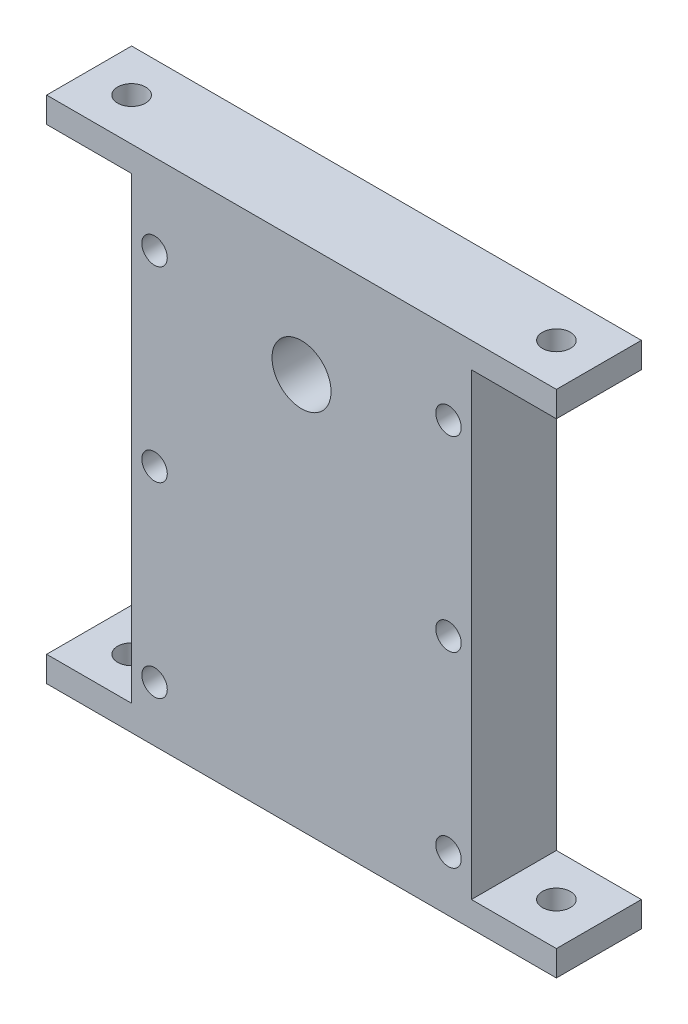
ISO-10303-21;
HEADER;
FILE_DESCRIPTION(('STEP AP214'),'2;1');
FILE_NAME('part.step','',(''),(''),'','','');
FILE_SCHEMA(('AUTOMOTIVE_DESIGN { 1 0 10303 214 1 1 1 1 }'));
ENDSEC;
DATA;
#1=APPLICATION_CONTEXT('core data for automotive mechanical design processes');
#2=APPLICATION_PROTOCOL_DEFINITION('international standard','automotive_design',2000,#1);
#3=PRODUCT_CONTEXT('',#1,'mechanical');
#4=PRODUCT('Part','Part','',(#3));
#5=PRODUCT_RELATED_PRODUCT_CATEGORY('part','',(#4));
#6=PRODUCT_DEFINITION_FORMATION('','',#4);
#7=PRODUCT_DEFINITION_CONTEXT('part definition',#1,'design');
#8=PRODUCT_DEFINITION('design','',#6,#7);
#9=PRODUCT_DEFINITION_SHAPE('','',#8);
#10=(LENGTH_UNIT() NAMED_UNIT(*) SI_UNIT(.MILLI.,.METRE.));
#11=(NAMED_UNIT(*) PLANE_ANGLE_UNIT() SI_UNIT($,.RADIAN.));
#12=(NAMED_UNIT(*) SI_UNIT($,.STERADIAN.) SOLID_ANGLE_UNIT());
#13=UNCERTAINTY_MEASURE_WITH_UNIT(LENGTH_MEASURE(1.E-05),#10,'distance_accuracy_value','');
#14=(GEOMETRIC_REPRESENTATION_CONTEXT(3) GLOBAL_UNCERTAINTY_ASSIGNED_CONTEXT((#13)) GLOBAL_UNIT_ASSIGNED_CONTEXT((#10,
#11,#12)) REPRESENTATION_CONTEXT('',''));
#15=CARTESIAN_POINT('',(0.,0.,0.));
#16=DIRECTION('',(0.,0.,1.));
#17=DIRECTION('',(1.,0.,0.));
#18=AXIS2_PLACEMENT_3D('',#15,#16,#17);
#19=CARTESIAN_POINT('',(-20.,30.,10.));
#20=DIRECTION('',(1.,0.,0.));
#21=DIRECTION('',(0.,1.,0.));
#22=AXIS2_PLACEMENT_3D('',#19,#20,#21);
#23=PLANE('',#22);
#24=DIRECTION('',(0.,0.,-1.));
#25=VECTOR('',#24,1.);
#26=CARTESIAN_POINT('',(-20.,-27.,0.));
#27=LINE('',#26,#25);
#28=CARTESIAN_POINT('',(-20.,-27.,10.));
#29=VERTEX_POINT('',#28);
#30=CARTESIAN_POINT('',(-20.,-27.,0.));
#31=VERTEX_POINT('',#30);
#32=EDGE_CURVE('E137',#29,#31,#27,.T.);
#33=ORIENTED_EDGE('',*,*,#32,.F.);
#34=DIRECTION('',(0.,-1.,0.));
#35=VECTOR('',#34,1.);
#36=CARTESIAN_POINT('',(-20.,30.,10.));
#37=LINE('',#36,#35);
#38=CARTESIAN_POINT('',(-20.,27.,10.));
#39=VERTEX_POINT('',#38);
#40=EDGE_CURVE('E55',#39,#29,#37,.T.);
#41=ORIENTED_EDGE('',*,*,#40,.F.);
#42=DIRECTION('',(0.,0.,1.));
#43=VECTOR('',#42,1.);
#44=CARTESIAN_POINT('',(-20.,27.,10.));
#45=LINE('',#44,#43);
#46=CARTESIAN_POINT('',(-20.,27.,0.));
#47=VERTEX_POINT('',#46);
#48=EDGE_CURVE('E63',#47,#39,#45,.T.);
#49=ORIENTED_EDGE('',*,*,#48,.F.);
#50=DIRECTION('',(0.,-1.,0.));
#51=VECTOR('',#50,1.);
#52=CARTESIAN_POINT('',(-20.,30.,0.));
#53=LINE('',#52,#51);
#54=EDGE_CURVE('E154',#47,#31,#53,.T.);
#55=ORIENTED_EDGE('',*,*,#54,.T.);
#56=EDGE_LOOP('',(#33,#41,#49,#55));
#57=FACE_BOUND('',#56,.T.);
#58=ADVANCED_FACE('F45',(#57),#23,.F.);
#59=CARTESIAN_POINT('',(20.,30.,10.));
#60=DIRECTION('',(-1.,0.,0.));
#61=DIRECTION('',(0.,-1.,0.));
#62=AXIS2_PLACEMENT_3D('',#59,#60,#61);
#63=PLANE('',#62);
#64=DIRECTION('',(0.,0.,1.));
#65=VECTOR('',#64,1.);
#66=CARTESIAN_POINT('',(20.,-27.,0.));
#67=LINE('',#66,#65);
#68=CARTESIAN_POINT('',(20.,-27.,0.));
#69=VERTEX_POINT('',#68);
#70=CARTESIAN_POINT('',(20.,-27.,10.));
#71=VERTEX_POINT('',#70);
#72=EDGE_CURVE('E248',#69,#71,#67,.T.);
#73=ORIENTED_EDGE('',*,*,#72,.F.);
#74=DIRECTION('',(0.,1.,0.));
#75=VECTOR('',#74,1.);
#76=CARTESIAN_POINT('',(20.,30.,0.));
#77=LINE('',#76,#75);
#78=CARTESIAN_POINT('',(20.,27.,0.));
#79=VERTEX_POINT('',#78);
#80=EDGE_CURVE('E167',#69,#79,#77,.T.);
#81=ORIENTED_EDGE('',*,*,#80,.T.);
#82=DIRECTION('',(0.,0.,-1.));
#83=VECTOR('',#82,1.);
#84=CARTESIAN_POINT('',(20.,27.,10.));
#85=LINE('',#84,#83);
#86=CARTESIAN_POINT('',(20.,27.,10.));
#87=VERTEX_POINT('',#86);
#88=EDGE_CURVE('E251',#87,#79,#85,.T.);
#89=ORIENTED_EDGE('',*,*,#88,.F.);
#90=DIRECTION('',(0.,1.,0.));
#91=VECTOR('',#90,1.);
#92=CARTESIAN_POINT('',(20.,30.,10.));
#93=LINE('',#92,#91);
#94=EDGE_CURVE('E71',#71,#87,#93,.T.);
#95=ORIENTED_EDGE('',*,*,#94,.F.);
#96=EDGE_LOOP('',(#73,#81,#89,#95));
#97=FACE_BOUND('',#96,.T.);
#98=ADVANCED_FACE('F47',(#97),#63,.F.);
#99=CARTESIAN_POINT('',(0.,0.,10.));
#100=DIRECTION('',(0.,0.,1.));
#101=DIRECTION('',(1.,0.,0.));
#102=AXIS2_PLACEMENT_3D('',#99,#100,#101);
#103=PLANE('',#102);
#104=CARTESIAN_POINT('',(17.3,-1.5,10.));
#105=DIRECTION('',(0.,0.,1.));
#106=DIRECTION('',(-1.,0.,0.));
#107=AXIS2_PLACEMENT_3D('',#104,#105,#106);
#108=CIRCLE('',#107,1.5);
#109=CARTESIAN_POINT('',(15.8,-1.5,10.));
#110=VERTEX_POINT('',#109);
#111=EDGE_CURVE('E299',#110,#110,#108,.T.);
#112=ORIENTED_EDGE('',*,*,#111,.F.);
#113=EDGE_LOOP('',(#112));
#114=FACE_BOUND('',#113,.T.);
#115=CARTESIAN_POINT('',(-17.3,-23.5,10.));
#116=DIRECTION('',(0.,0.,1.));
#117=DIRECTION('',(1.,0.,0.));
#118=AXIS2_PLACEMENT_3D('',#115,#116,#117);
#119=CIRCLE('',#118,1.5);
#120=CARTESIAN_POINT('',(-15.8,-23.5,10.));
#121=VERTEX_POINT('',#120);
#122=EDGE_CURVE('E315',#121,#121,#119,.T.);
#123=ORIENTED_EDGE('',*,*,#122,.F.);
#124=EDGE_LOOP('',(#123));
#125=FACE_BOUND('',#124,.T.);
#126=CARTESIAN_POINT('',(-17.3,20.5,10.));
#127=DIRECTION('',(0.,0.,1.));
#128=DIRECTION('',(1.,0.,0.));
#129=AXIS2_PLACEMENT_3D('',#126,#127,#128);
#130=CIRCLE('',#129,1.5);
#131=CARTESIAN_POINT('',(-15.8,20.5,10.));
#132=VERTEX_POINT('',#131);
#133=EDGE_CURVE('E331',#132,#132,#130,.T.);
#134=ORIENTED_EDGE('',*,*,#133,.F.);
#135=EDGE_LOOP('',(#134));
#136=FACE_BOUND('',#135,.T.);
#137=DIRECTION('',(1.,0.,0.));
#138=VECTOR('',#137,1.);
#139=CARTESIAN_POINT('',(-20.,-30.,10.));
#140=LINE('',#139,#138);
#141=CARTESIAN_POINT('',(-30.,-30.,10.));
#142=VERTEX_POINT('',#141);
#143=CARTESIAN_POINT('',(30.,-30.,10.));
#144=VERTEX_POINT('',#143);
#145=EDGE_CURVE('E11',#142,#144,#140,.T.);
#146=ORIENTED_EDGE('',*,*,#145,.T.);
#147=DIRECTION('',(0.,-1.,0.));
#148=VECTOR('',#147,1.);
#149=CARTESIAN_POINT('',(30.,-27.,10.));
#150=LINE('',#149,#148);
#151=CARTESIAN_POINT('',(30.,-27.,10.));
#152=VERTEX_POINT('',#151);
#153=EDGE_CURVE('E247',#152,#144,#150,.T.);
#154=ORIENTED_EDGE('',*,*,#153,.F.);
#155=DIRECTION('',(-1.,0.,0.));
#156=VECTOR('',#155,1.);
#157=CARTESIAN_POINT('',(30.,-27.,10.));
#158=LINE('',#157,#156);
#159=EDGE_CURVE('E243',#152,#71,#158,.T.);
#160=ORIENTED_EDGE('',*,*,#159,.T.);
#161=ORIENTED_EDGE('',*,*,#94,.T.);
#162=DIRECTION('',(-1.,0.,0.));
#163=VECTOR('',#162,1.);
#164=CARTESIAN_POINT('',(30.,27.,10.));
#165=LINE('',#164,#163);
#166=CARTESIAN_POINT('',(30.,27.,10.));
#167=VERTEX_POINT('',#166);
#168=EDGE_CURVE('E286',#167,#87,#165,.T.);
#169=ORIENTED_EDGE('',*,*,#168,.F.);
#170=DIRECTION('',(0.,-1.,0.));
#171=VECTOR('',#170,1.);
#172=CARTESIAN_POINT('',(30.,30.,10.));
#173=LINE('',#172,#171);
#174=CARTESIAN_POINT('',(30.,30.,10.));
#175=VERTEX_POINT('',#174);
#176=EDGE_CURVE('E273',#175,#167,#173,.T.);
#177=ORIENTED_EDGE('',*,*,#176,.F.);
#178=DIRECTION('',(-1.,0.,0.));
#179=VECTOR('',#178,1.);
#180=CARTESIAN_POINT('',(-20.,30.,10.));
#181=LINE('',#180,#179);
#182=CARTESIAN_POINT('',(-30.,30.,10.));
#183=VERTEX_POINT('',#182);
#184=EDGE_CURVE('E348',#175,#183,#181,.T.);
#185=ORIENTED_EDGE('',*,*,#184,.T.);
#186=DIRECTION('',(0.,1.,0.));
#187=VECTOR('',#186,1.);
#188=CARTESIAN_POINT('',(-30.,30.,10.));
#189=LINE('',#188,#187);
#190=CARTESIAN_POINT('',(-30.,27.,10.));
#191=VERTEX_POINT('',#190);
#192=EDGE_CURVE('E222',#191,#183,#189,.T.);
#193=ORIENTED_EDGE('',*,*,#192,.F.);
#194=DIRECTION('',(1.,0.,0.));
#195=VECTOR('',#194,1.);
#196=CARTESIAN_POINT('',(-30.,27.,10.));
#197=LINE('',#196,#195);
#198=EDGE_CURVE('E230',#191,#39,#197,.T.);
#199=ORIENTED_EDGE('',*,*,#198,.T.);
#200=ORIENTED_EDGE('',*,*,#40,.T.);
#201=DIRECTION('',(1.,0.,0.));
#202=VECTOR('',#201,1.);
#203=CARTESIAN_POINT('',(-30.,-27.,10.));
#204=LINE('',#203,#202);
#205=CARTESIAN_POINT('',(-30.,-27.,10.));
#206=VERTEX_POINT('',#205);
#207=EDGE_CURVE('E144',#206,#29,#204,.T.);
#208=ORIENTED_EDGE('',*,*,#207,.F.);
#209=DIRECTION('',(0.,1.,0.));
#210=VECTOR('',#209,1.);
#211=CARTESIAN_POINT('',(-30.,-30.,10.));
#212=LINE('',#211,#210);
#213=EDGE_CURVE('E206',#142,#206,#212,.T.);
#214=ORIENTED_EDGE('',*,*,#213,.F.);
#215=EDGE_LOOP('',(#146,#154,#160,#161,#169,#177,#185,#193,#199,#200,#208,#214));
#216=FACE_BOUND('',#215,.T.);
#217=CARTESIAN_POINT('',(-17.3,-1.5,10.));
#218=DIRECTION('',(0.,0.,1.));
#219=DIRECTION('',(1.,0.,0.));
#220=AXIS2_PLACEMENT_3D('',#217,#218,#219);
#221=CIRCLE('',#220,1.5);
#222=CARTESIAN_POINT('',(-15.8,-1.5,10.));
#223=VERTEX_POINT('',#222);
#224=EDGE_CURVE('E339',#223,#223,#221,.T.);
#225=ORIENTED_EDGE('',*,*,#224,.F.);
#226=EDGE_LOOP('',(#225));
#227=FACE_BOUND('',#226,.T.);
#228=CARTESIAN_POINT('',(0.,16.5,10.));
#229=DIRECTION('',(0.,0.,1.));
#230=DIRECTION('',(1.,0.,0.));
#231=AXIS2_PLACEMENT_3D('',#228,#229,#230);
#232=CIRCLE('',#231,3.475);
#233=CARTESIAN_POINT('',(3.475,16.5,10.));
#234=VERTEX_POINT('',#233);
#235=EDGE_CURVE('E323',#234,#234,#232,.T.);
#236=ORIENTED_EDGE('',*,*,#235,.F.);
#237=EDGE_LOOP('',(#236));
#238=FACE_BOUND('',#237,.T.);
#239=CARTESIAN_POINT('',(17.3,-23.5,10.));
#240=DIRECTION('',(0.,0.,1.));
#241=DIRECTION('',(-1.,0.,0.));
#242=AXIS2_PLACEMENT_3D('',#239,#240,#241);
#243=CIRCLE('',#242,1.5);
#244=CARTESIAN_POINT('',(15.8,-23.5,10.));
#245=VERTEX_POINT('',#244);
#246=EDGE_CURVE('E307',#245,#245,#243,.T.);
#247=ORIENTED_EDGE('',*,*,#246,.F.);
#248=EDGE_LOOP('',(#247));
#249=FACE_BOUND('',#248,.T.);
#250=CARTESIAN_POINT('',(17.3,20.5,10.));
#251=DIRECTION('',(0.,0.,1.));
#252=DIRECTION('',(-1.,0.,0.));
#253=AXIS2_PLACEMENT_3D('',#250,#251,#252);
#254=CIRCLE('',#253,1.5);
#255=CARTESIAN_POINT('',(15.8,20.5,10.));
#256=VERTEX_POINT('',#255);
#257=EDGE_CURVE('E291',#256,#256,#254,.T.);
#258=ORIENTED_EDGE('',*,*,#257,.F.);
#259=EDGE_LOOP('',(#258));
#260=FACE_BOUND('',#259,.T.);
#261=ADVANCED_FACE('F366',(#114,#125,#136,#216,#227,#238,#249,#260),#103,.T.);
#262=CARTESIAN_POINT('',(0.,0.,0.));
#263=DIRECTION('',(0.,0.,1.));
#264=DIRECTION('',(1.,0.,0.));
#265=AXIS2_PLACEMENT_3D('',#262,#263,#264);
#266=PLANE('',#265);
#267=ORIENTED_EDGE('',*,*,#80,.F.);
#268=DIRECTION('',(-1.,0.,0.));
#269=VECTOR('',#268,1.);
#270=CARTESIAN_POINT('',(30.,-27.,0.));
#271=LINE('',#270,#269);
#272=CARTESIAN_POINT('',(30.,-27.,0.));
#273=VERTEX_POINT('',#272);
#274=EDGE_CURVE('E239',#273,#69,#271,.T.);
#275=ORIENTED_EDGE('',*,*,#274,.F.);
#276=DIRECTION('',(0.,1.,0.));
#277=VECTOR('',#276,1.);
#278=CARTESIAN_POINT('',(30.,-30.,0.));
#279=LINE('',#278,#277);
#280=CARTESIAN_POINT('',(30.,-30.,0.));
#281=VERTEX_POINT('',#280);
#282=EDGE_CURVE('E259',#281,#273,#279,.T.);
#283=ORIENTED_EDGE('',*,*,#282,.F.);
#284=DIRECTION('',(1.,0.,0.));
#285=VECTOR('',#284,1.);
#286=CARTESIAN_POINT('',(-20.,-30.,0.));
#287=LINE('',#286,#285);
#288=CARTESIAN_POINT('',(-30.,-30.,0.));
#289=VERTEX_POINT('',#288);
#290=EDGE_CURVE('E161',#289,#281,#287,.T.);
#291=ORIENTED_EDGE('',*,*,#290,.F.);
#292=DIRECTION('',(0.,-1.,0.));
#293=VECTOR('',#292,1.);
#294=CARTESIAN_POINT('',(-30.,-30.,0.));
#295=LINE('',#294,#293);
#296=CARTESIAN_POINT('',(-30.,-27.,0.));
#297=VERTEX_POINT('',#296);
#298=EDGE_CURVE('E147',#297,#289,#295,.T.);
#299=ORIENTED_EDGE('',*,*,#298,.F.);
#300=DIRECTION('',(1.,0.,0.));
#301=VECTOR('',#300,1.);
#302=CARTESIAN_POINT('',(-30.,-27.,0.));
#303=LINE('',#302,#301);
#304=EDGE_CURVE('E141',#297,#31,#303,.T.);
#305=ORIENTED_EDGE('',*,*,#304,.T.);
#306=ORIENTED_EDGE('',*,*,#54,.F.);
#307=DIRECTION('',(1.,0.,0.));
#308=VECTOR('',#307,1.);
#309=CARTESIAN_POINT('',(-30.,27.,0.));
#310=LINE('',#309,#308);
#311=CARTESIAN_POINT('',(-30.,27.,0.));
#312=VERTEX_POINT('',#311);
#313=EDGE_CURVE('E236',#312,#47,#310,.T.);
#314=ORIENTED_EDGE('',*,*,#313,.F.);
#315=DIRECTION('',(0.,-1.,0.));
#316=VECTOR('',#315,1.);
#317=CARTESIAN_POINT('',(-30.,27.,0.));
#318=LINE('',#317,#316);
#319=CARTESIAN_POINT('',(-30.,30.,0.));
#320=VERTEX_POINT('',#319);
#321=EDGE_CURVE('E215',#320,#312,#318,.T.);
#322=ORIENTED_EDGE('',*,*,#321,.F.);
#323=DIRECTION('',(-1.,0.,0.));
#324=VECTOR('',#323,1.);
#325=CARTESIAN_POINT('',(-20.,30.,0.));
#326=LINE('',#325,#324);
#327=CARTESIAN_POINT('',(30.,30.,0.));
#328=VERTEX_POINT('',#327);
#329=EDGE_CURVE('E162',#328,#320,#326,.T.);
#330=ORIENTED_EDGE('',*,*,#329,.F.);
#331=DIRECTION('',(0.,1.,0.));
#332=VECTOR('',#331,1.);
#333=CARTESIAN_POINT('',(30.,27.,0.));
#334=LINE('',#333,#332);
#335=CARTESIAN_POINT('',(30.,27.,0.));
#336=VERTEX_POINT('',#335);
#337=EDGE_CURVE('E265',#336,#328,#334,.T.);
#338=ORIENTED_EDGE('',*,*,#337,.F.);
#339=DIRECTION('',(-1.,0.,0.));
#340=VECTOR('',#339,1.);
#341=CARTESIAN_POINT('',(30.,27.,0.));
#342=LINE('',#341,#340);
#343=EDGE_CURVE('E279',#336,#79,#342,.T.);
#344=ORIENTED_EDGE('',*,*,#343,.T.);
#345=EDGE_LOOP('',(#267,#275,#283,#291,#299,#305,#306,#314,#322,#330,#338,#344));
#346=FACE_BOUND('',#345,.T.);
#347=CARTESIAN_POINT('',(-17.3,-1.5,0.));
#348=DIRECTION('',(0.,0.,1.));
#349=DIRECTION('',(1.,0.,0.));
#350=AXIS2_PLACEMENT_3D('',#347,#348,#349);
#351=CIRCLE('',#350,1.5);
#352=CARTESIAN_POINT('',(-15.8,-1.5,0.));
#353=VERTEX_POINT('',#352);
#354=EDGE_CURVE('E335',#353,#353,#351,.T.);
#355=ORIENTED_EDGE('',*,*,#354,.T.);
#356=EDGE_LOOP('',(#355));
#357=FACE_BOUND('',#356,.T.);
#358=CARTESIAN_POINT('',(-17.3,20.5,0.));
#359=DIRECTION('',(0.,0.,1.));
#360=DIRECTION('',(1.,0.,0.));
#361=AXIS2_PLACEMENT_3D('',#358,#359,#360);
#362=CIRCLE('',#361,1.5);
#363=CARTESIAN_POINT('',(-15.8,20.5,0.));
#364=VERTEX_POINT('',#363);
#365=EDGE_CURVE('E327',#364,#364,#362,.T.);
#366=ORIENTED_EDGE('',*,*,#365,.T.);
#367=EDGE_LOOP('',(#366));
#368=FACE_BOUND('',#367,.T.);
#369=CARTESIAN_POINT('',(0.,16.5,0.));
#370=DIRECTION('',(0.,0.,1.));
#371=DIRECTION('',(1.,0.,0.));
#372=AXIS2_PLACEMENT_3D('',#369,#370,#371);
#373=CIRCLE('',#372,3.475);
#374=CARTESIAN_POINT('',(3.475,16.5,0.));
#375=VERTEX_POINT('',#374);
#376=EDGE_CURVE('E319',#375,#375,#373,.T.);
#377=ORIENTED_EDGE('',*,*,#376,.T.);
#378=EDGE_LOOP('',(#377));
#379=FACE_BOUND('',#378,.T.);
#380=CARTESIAN_POINT('',(-17.3,-23.5,0.));
#381=DIRECTION('',(0.,0.,1.));
#382=DIRECTION('',(1.,0.,0.));
#383=AXIS2_PLACEMENT_3D('',#380,#381,#382);
#384=CIRCLE('',#383,1.5);
#385=CARTESIAN_POINT('',(-15.8,-23.5,0.));
#386=VERTEX_POINT('',#385);
#387=EDGE_CURVE('E311',#386,#386,#384,.T.);
#388=ORIENTED_EDGE('',*,*,#387,.T.);
#389=EDGE_LOOP('',(#388));
#390=FACE_BOUND('',#389,.T.);
#391=CARTESIAN_POINT('',(17.3,-23.5,0.));
#392=DIRECTION('',(0.,0.,1.));
#393=DIRECTION('',(-1.,0.,0.));
#394=AXIS2_PLACEMENT_3D('',#391,#392,#393);
#395=CIRCLE('',#394,1.5);
#396=CARTESIAN_POINT('',(15.8,-23.5,0.));
#397=VERTEX_POINT('',#396);
#398=EDGE_CURVE('E303',#397,#397,#395,.T.);
#399=ORIENTED_EDGE('',*,*,#398,.T.);
#400=EDGE_LOOP('',(#399));
#401=FACE_BOUND('',#400,.T.);
#402=CARTESIAN_POINT('',(17.3,-1.5,0.));
#403=DIRECTION('',(0.,0.,1.));
#404=DIRECTION('',(-1.,0.,0.));
#405=AXIS2_PLACEMENT_3D('',#402,#403,#404);
#406=CIRCLE('',#405,1.5);
#407=CARTESIAN_POINT('',(15.8,-1.5,0.));
#408=VERTEX_POINT('',#407);
#409=EDGE_CURVE('E295',#408,#408,#406,.T.);
#410=ORIENTED_EDGE('',*,*,#409,.T.);
#411=EDGE_LOOP('',(#410));
#412=FACE_BOUND('',#411,.T.);
#413=CARTESIAN_POINT('',(17.3,20.5,0.));
#414=DIRECTION('',(0.,0.,1.));
#415=DIRECTION('',(-1.,0.,0.));
#416=AXIS2_PLACEMENT_3D('',#413,#414,#415);
#417=CIRCLE('',#416,1.5);
#418=CARTESIAN_POINT('',(15.8,20.5,0.));
#419=VERTEX_POINT('',#418);
#420=EDGE_CURVE('E290',#419,#419,#417,.T.);
#421=ORIENTED_EDGE('',*,*,#420,.T.);
#422=EDGE_LOOP('',(#421));
#423=FACE_BOUND('',#422,.T.);
#424=ADVANCED_FACE('F151',(#346,#357,#368,#379,#390,#401,#412,#423),#266,.F.);
#425=CARTESIAN_POINT('',(-20.,30.,10.));
#426=DIRECTION('',(0.,-1.,0.));
#427=DIRECTION('',(0.,0.,-1.));
#428=AXIS2_PLACEMENT_3D('',#425,#426,#427);
#429=PLANE('',#428);
#430=CARTESIAN_POINT('',(-25.,30.,5.));
#431=DIRECTION('',(0.,-1.,0.));
#432=DIRECTION('',(1.,0.,0.));
#433=AXIS2_PLACEMENT_3D('',#430,#431,#432);
#434=CIRCLE('',#433,1.65);
#435=CARTESIAN_POINT('',(-23.35,30.,5.));
#436=VERTEX_POINT('',#435);
#437=EDGE_CURVE('E174',#436,#436,#434,.T.);
#438=ORIENTED_EDGE('',*,*,#437,.T.);
#439=EDGE_LOOP('',(#438));
#440=FACE_BOUND('',#439,.T.);
#441=CARTESIAN_POINT('',(25.,30.,5.));
#442=DIRECTION('',(0.,-1.,0.));
#443=DIRECTION('',(-1.,0.,0.));
#444=AXIS2_PLACEMENT_3D('',#441,#442,#443);
#445=CIRCLE('',#444,1.65);
#446=CARTESIAN_POINT('',(23.35,30.,5.));
#447=VERTEX_POINT('',#446);
#448=EDGE_CURVE('E191',#447,#447,#445,.T.);
#449=ORIENTED_EDGE('',*,*,#448,.T.);
#450=EDGE_LOOP('',(#449));
#451=FACE_BOUND('',#450,.T.);
#452=ORIENTED_EDGE('',*,*,#329,.T.);
#453=DIRECTION('',(0.,0.,-1.));
#454=VECTOR('',#453,1.);
#455=CARTESIAN_POINT('',(-30.,30.,0.));
#456=LINE('',#455,#454);
#457=EDGE_CURVE('E226',#183,#320,#456,.T.);
#458=ORIENTED_EDGE('',*,*,#457,.F.);
#459=ORIENTED_EDGE('',*,*,#184,.F.);
#460=DIRECTION('',(0.,0.,1.));
#461=VECTOR('',#460,1.);
#462=CARTESIAN_POINT('',(30.,30.,0.));
#463=LINE('',#462,#461);
#464=EDGE_CURVE('E269',#328,#175,#463,.T.);
#465=ORIENTED_EDGE('',*,*,#464,.F.);
#466=EDGE_LOOP('',(#452,#458,#459,#465));
#467=FACE_BOUND('',#466,.T.);
#468=ADVANCED_FACE('F391',(#440,#451,#467),#429,.F.);
#469=CARTESIAN_POINT('',(-20.,-30.,10.));
#470=DIRECTION('',(0.,1.,0.));
#471=DIRECTION('',(-1.,0.,0.));
#472=AXIS2_PLACEMENT_3D('',#469,#470,#471);
#473=PLANE('',#472);
#474=CARTESIAN_POINT('',(-25.,-30.,5.));
#475=DIRECTION('',(0.,-1.,0.));
#476=DIRECTION('',(1.,0.,0.));
#477=AXIS2_PLACEMENT_3D('',#474,#475,#476);
#478=CIRCLE('',#477,1.65);
#479=CARTESIAN_POINT('',(-23.35,-30.,5.));
#480=VERTEX_POINT('',#479);
#481=EDGE_CURVE('E182',#480,#480,#478,.T.);
#482=ORIENTED_EDGE('',*,*,#481,.F.);
#483=EDGE_LOOP('',(#482));
#484=FACE_BOUND('',#483,.T.);
#485=CARTESIAN_POINT('',(25.,-30.,5.));
#486=DIRECTION('',(0.,-1.,0.));
#487=DIRECTION('',(-1.,0.,0.));
#488=AXIS2_PLACEMENT_3D('',#485,#486,#487);
#489=CIRCLE('',#488,1.65);
#490=CARTESIAN_POINT('',(23.35,-30.,5.));
#491=VERTEX_POINT('',#490);
#492=EDGE_CURVE('E188',#491,#491,#489,.T.);
#493=ORIENTED_EDGE('',*,*,#492,.F.);
#494=EDGE_LOOP('',(#493));
#495=FACE_BOUND('',#494,.T.);
#496=ORIENTED_EDGE('',*,*,#290,.T.);
#497=DIRECTION('',(0.,0.,-1.));
#498=VECTOR('',#497,1.);
#499=CARTESIAN_POINT('',(30.,-30.,10.));
#500=LINE('',#499,#498);
#501=EDGE_CURVE('E252',#144,#281,#500,.T.);
#502=ORIENTED_EDGE('',*,*,#501,.F.);
#503=ORIENTED_EDGE('',*,*,#145,.F.);
#504=DIRECTION('',(0.,0.,1.));
#505=VECTOR('',#504,1.);
#506=CARTESIAN_POINT('',(-30.,-30.,0.));
#507=LINE('',#506,#505);
#508=EDGE_CURVE('E209',#289,#142,#507,.T.);
#509=ORIENTED_EDGE('',*,*,#508,.F.);
#510=EDGE_LOOP('',(#496,#502,#503,#509));
#511=FACE_BOUND('',#510,.T.);
#512=ADVANCED_FACE('F379',(#484,#495,#511),#473,.F.);
#513=CARTESIAN_POINT('',(-17.3,-1.5,10.));
#514=DIRECTION('',(0.,0.,-1.));
#515=DIRECTION('',(-1.,0.,0.));
#516=AXIS2_PLACEMENT_3D('',#513,#514,#515);
#517=CYLINDRICAL_SURFACE('',#516,1.5);
#518=ORIENTED_EDGE('',*,*,#224,.T.);
#519=EDGE_LOOP('',(#518));
#520=FACE_BOUND('',#519,.T.);
#521=ORIENTED_EDGE('',*,*,#354,.F.);
#522=EDGE_LOOP('',(#521));
#523=FACE_BOUND('',#522,.T.);
#524=ADVANCED_FACE('F397',(#520,#523),#517,.F.);
#525=CARTESIAN_POINT('',(-17.3,20.5,10.));
#526=DIRECTION('',(0.,0.,-1.));
#527=DIRECTION('',(-1.,0.,0.));
#528=AXIS2_PLACEMENT_3D('',#525,#526,#527);
#529=CYLINDRICAL_SURFACE('',#528,1.5);
#530=ORIENTED_EDGE('',*,*,#133,.T.);
#531=EDGE_LOOP('',(#530));
#532=FACE_BOUND('',#531,.T.);
#533=ORIENTED_EDGE('',*,*,#365,.F.);
#534=EDGE_LOOP('',(#533));
#535=FACE_BOUND('',#534,.T.);
#536=ADVANCED_FACE('F415',(#532,#535),#529,.F.);
#537=CARTESIAN_POINT('',(0.,16.5,10.));
#538=DIRECTION('',(0.,0.,-1.));
#539=DIRECTION('',(-1.,0.,0.));
#540=AXIS2_PLACEMENT_3D('',#537,#538,#539);
#541=CYLINDRICAL_SURFACE('',#540,3.475);
#542=ORIENTED_EDGE('',*,*,#235,.T.);
#543=EDGE_LOOP('',(#542));
#544=FACE_BOUND('',#543,.T.);
#545=ORIENTED_EDGE('',*,*,#376,.F.);
#546=EDGE_LOOP('',(#545));
#547=FACE_BOUND('',#546,.T.);
#548=ADVANCED_FACE('F419',(#544,#547),#541,.F.);
#549=CARTESIAN_POINT('',(-17.3,-23.5,10.));
#550=DIRECTION('',(0.,0.,-1.));
#551=DIRECTION('',(-1.,0.,0.));
#552=AXIS2_PLACEMENT_3D('',#549,#550,#551);
#553=CYLINDRICAL_SURFACE('',#552,1.5);
#554=ORIENTED_EDGE('',*,*,#122,.T.);
#555=EDGE_LOOP('',(#554));
#556=FACE_BOUND('',#555,.T.);
#557=ORIENTED_EDGE('',*,*,#387,.F.);
#558=EDGE_LOOP('',(#557));
#559=FACE_BOUND('',#558,.T.);
#560=ADVANCED_FACE('F423',(#556,#559),#553,.F.);
#561=CARTESIAN_POINT('',(17.3,-23.5,10.));
#562=DIRECTION('',(0.,0.,-1.));
#563=DIRECTION('',(-1.,0.,0.));
#564=AXIS2_PLACEMENT_3D('',#561,#562,#563);
#565=CYLINDRICAL_SURFACE('',#564,1.5);
#566=ORIENTED_EDGE('',*,*,#246,.T.);
#567=EDGE_LOOP('',(#566));
#568=FACE_BOUND('',#567,.T.);
#569=ORIENTED_EDGE('',*,*,#398,.F.);
#570=EDGE_LOOP('',(#569));
#571=FACE_BOUND('',#570,.T.);
#572=ADVANCED_FACE('F427',(#568,#571),#565,.F.);
#573=CARTESIAN_POINT('',(17.3,-1.5,10.));
#574=DIRECTION('',(0.,0.,-1.));
#575=DIRECTION('',(-1.,0.,0.));
#576=AXIS2_PLACEMENT_3D('',#573,#574,#575);
#577=CYLINDRICAL_SURFACE('',#576,1.5);
#578=ORIENTED_EDGE('',*,*,#111,.T.);
#579=EDGE_LOOP('',(#578));
#580=FACE_BOUND('',#579,.T.);
#581=ORIENTED_EDGE('',*,*,#409,.F.);
#582=EDGE_LOOP('',(#581));
#583=FACE_BOUND('',#582,.T.);
#584=ADVANCED_FACE('F431',(#580,#583),#577,.F.);
#585=CARTESIAN_POINT('',(17.3,20.5,10.));
#586=DIRECTION('',(0.,0.,-1.));
#587=DIRECTION('',(-1.,0.,0.));
#588=AXIS2_PLACEMENT_3D('',#585,#586,#587);
#589=CYLINDRICAL_SURFACE('',#588,1.5);
#590=ORIENTED_EDGE('',*,*,#257,.T.);
#591=EDGE_LOOP('',(#590));
#592=FACE_BOUND('',#591,.T.);
#593=ORIENTED_EDGE('',*,*,#420,.F.);
#594=EDGE_LOOP('',(#593));
#595=FACE_BOUND('',#594,.T.);
#596=ADVANCED_FACE('F435',(#592,#595),#589,.F.);
#597=CARTESIAN_POINT('',(30.,27.,10.));
#598=DIRECTION('',(0.,1.,0.));
#599=DIRECTION('',(-1.,0.,0.));
#600=AXIS2_PLACEMENT_3D('',#597,#598,#599);
#601=PLANE('',#600);
#602=CARTESIAN_POINT('',(25.,27.,5.));
#603=DIRECTION('',(0.,1.,0.));
#604=DIRECTION('',(-1.,0.,0.));
#605=AXIS2_PLACEMENT_3D('',#602,#603,#604);
#606=CIRCLE('',#605,1.65);
#607=CARTESIAN_POINT('',(23.35,27.,5.));
#608=VERTEX_POINT('',#607);
#609=EDGE_CURVE('E198',#608,#608,#606,.T.);
#610=ORIENTED_EDGE('',*,*,#609,.T.);
#611=EDGE_LOOP('',(#610));
#612=FACE_BOUND('',#611,.T.);
#613=ORIENTED_EDGE('',*,*,#88,.T.);
#614=ORIENTED_EDGE('',*,*,#343,.F.);
#615=DIRECTION('',(0.,0.,-1.));
#616=VECTOR('',#615,1.);
#617=CARTESIAN_POINT('',(30.,27.,10.));
#618=LINE('',#617,#616);
#619=EDGE_CURVE('E276',#167,#336,#618,.T.);
#620=ORIENTED_EDGE('',*,*,#619,.F.);
#621=ORIENTED_EDGE('',*,*,#168,.T.);
#622=EDGE_LOOP('',(#613,#614,#620,#621));
#623=FACE_BOUND('',#622,.T.);
#624=ADVANCED_FACE('F356',(#612,#623),#601,.F.);
#625=CARTESIAN_POINT('',(30.,0.,0.));
#626=DIRECTION('',(1.,0.,0.));
#627=DIRECTION('',(0.,0.,-1.));
#628=AXIS2_PLACEMENT_3D('',#625,#626,#627);
#629=PLANE('',#628);
#630=ORIENTED_EDGE('',*,*,#337,.T.);
#631=ORIENTED_EDGE('',*,*,#464,.T.);
#632=ORIENTED_EDGE('',*,*,#176,.T.);
#633=ORIENTED_EDGE('',*,*,#619,.T.);
#634=EDGE_LOOP('',(#630,#631,#632,#633));
#635=FACE_BOUND('',#634,.T.);
#636=ADVANCED_FACE('F363',(#635),#629,.T.);
#637=CARTESIAN_POINT('',(30.,-27.,0.));
#638=DIRECTION('',(0.,-1.,0.));
#639=DIRECTION('',(1.,0.,0.));
#640=AXIS2_PLACEMENT_3D('',#637,#638,#639);
#641=PLANE('',#640);
#642=CARTESIAN_POINT('',(25.,-27.,5.));
#643=DIRECTION('',(0.,-1.,0.));
#644=DIRECTION('',(1.,0.,0.));
#645=AXIS2_PLACEMENT_3D('',#642,#643,#644);
#646=CIRCLE('',#645,1.65);
#647=CARTESIAN_POINT('',(26.65,-27.,5.));
#648=VERTEX_POINT('',#647);
#649=EDGE_CURVE('E49',#648,#648,#646,.T.);
#650=ORIENTED_EDGE('',*,*,#649,.T.);
#651=EDGE_LOOP('',(#650));
#652=FACE_BOUND('',#651,.T.);
#653=ORIENTED_EDGE('',*,*,#72,.T.);
#654=ORIENTED_EDGE('',*,*,#159,.F.);
#655=DIRECTION('',(0.,0.,1.));
#656=VECTOR('',#655,1.);
#657=CARTESIAN_POINT('',(30.,-27.,0.));
#658=LINE('',#657,#656);
#659=EDGE_CURVE('E256',#273,#152,#658,.T.);
#660=ORIENTED_EDGE('',*,*,#659,.F.);
#661=ORIENTED_EDGE('',*,*,#274,.T.);
#662=EDGE_LOOP('',(#653,#654,#660,#661));
#663=FACE_BOUND('',#662,.T.);
#664=ADVANCED_FACE('F372',(#652,#663),#641,.F.);
#665=CARTESIAN_POINT('',(30.,0.,0.));
#666=DIRECTION('',(1.,0.,0.));
#667=DIRECTION('',(0.,0.,-1.));
#668=AXIS2_PLACEMENT_3D('',#665,#666,#667);
#669=PLANE('',#668);
#670=ORIENTED_EDGE('',*,*,#501,.T.);
#671=ORIENTED_EDGE('',*,*,#282,.T.);
#672=ORIENTED_EDGE('',*,*,#659,.T.);
#673=ORIENTED_EDGE('',*,*,#153,.T.);
#674=EDGE_LOOP('',(#670,#671,#672,#673));
#675=FACE_BOUND('',#674,.T.);
#676=ADVANCED_FACE('F377',(#675),#669,.T.);
#677=CARTESIAN_POINT('',(-30.,27.,10.));
#678=DIRECTION('',(0.,1.,0.));
#679=DIRECTION('',(-1.,0.,0.));
#680=AXIS2_PLACEMENT_3D('',#677,#678,#679);
#681=PLANE('',#680);
#682=CARTESIAN_POINT('',(-25.,27.,5.));
#683=DIRECTION('',(0.,1.,0.));
#684=DIRECTION('',(-1.,0.,0.));
#685=AXIS2_PLACEMENT_3D('',#682,#683,#684);
#686=CIRCLE('',#685,1.65);
#687=CARTESIAN_POINT('',(-26.65,27.,5.));
#688=VERTEX_POINT('',#687);
#689=EDGE_CURVE('E173',#688,#688,#686,.T.);
#690=ORIENTED_EDGE('',*,*,#689,.T.);
#691=EDGE_LOOP('',(#690));
#692=FACE_BOUND('',#691,.T.);
#693=ORIENTED_EDGE('',*,*,#48,.T.);
#694=ORIENTED_EDGE('',*,*,#198,.F.);
#695=DIRECTION('',(0.,0.,1.));
#696=VECTOR('',#695,1.);
#697=CARTESIAN_POINT('',(-30.,27.,10.));
#698=LINE('',#697,#696);
#699=EDGE_CURVE('E219',#312,#191,#698,.T.);
#700=ORIENTED_EDGE('',*,*,#699,.F.);
#701=ORIENTED_EDGE('',*,*,#313,.T.);
#702=EDGE_LOOP('',(#693,#694,#700,#701));
#703=FACE_BOUND('',#702,.T.);
#704=ADVANCED_FACE('F386',(#692,#703),#681,.F.);
#705=CARTESIAN_POINT('',(-30.,0.,0.));
#706=DIRECTION('',(1.,0.,0.));
#707=DIRECTION('',(0.,0.,-1.));
#708=AXIS2_PLACEMENT_3D('',#705,#706,#707);
#709=PLANE('',#708);
#710=ORIENTED_EDGE('',*,*,#321,.T.);
#711=ORIENTED_EDGE('',*,*,#699,.T.);
#712=ORIENTED_EDGE('',*,*,#192,.T.);
#713=ORIENTED_EDGE('',*,*,#457,.T.);
#714=EDGE_LOOP('',(#710,#711,#712,#713));
#715=FACE_BOUND('',#714,.T.);
#716=ADVANCED_FACE('F388',(#715),#709,.F.);
#717=CARTESIAN_POINT('',(-30.,-27.,0.));
#718=DIRECTION('',(0.,-1.,0.));
#719=DIRECTION('',(1.,0.,0.));
#720=AXIS2_PLACEMENT_3D('',#717,#718,#719);
#721=PLANE('',#720);
#722=CARTESIAN_POINT('',(-25.,-27.,5.));
#723=DIRECTION('',(0.,-1.,0.));
#724=DIRECTION('',(1.,0.,0.));
#725=AXIS2_PLACEMENT_3D('',#722,#723,#724);
#726=CIRCLE('',#725,1.65);
#727=CARTESIAN_POINT('',(-23.35,-27.,5.));
#728=VERTEX_POINT('',#727);
#729=EDGE_CURVE('E170',#728,#728,#726,.T.);
#730=ORIENTED_EDGE('',*,*,#729,.T.);
#731=EDGE_LOOP('',(#730));
#732=FACE_BOUND('',#731,.T.);
#733=ORIENTED_EDGE('',*,*,#32,.T.);
#734=ORIENTED_EDGE('',*,*,#304,.F.);
#735=DIRECTION('',(0.,0.,-1.));
#736=VECTOR('',#735,1.);
#737=CARTESIAN_POINT('',(-30.,-27.,0.));
#738=LINE('',#737,#736);
#739=EDGE_CURVE('E158',#206,#297,#738,.T.);
#740=ORIENTED_EDGE('',*,*,#739,.F.);
#741=ORIENTED_EDGE('',*,*,#207,.T.);
#742=EDGE_LOOP('',(#733,#734,#740,#741));
#743=FACE_BOUND('',#742,.T.);
#744=ADVANCED_FACE('F139',(#732,#743),#721,.F.);
#745=CARTESIAN_POINT('',(-30.,0.,0.));
#746=DIRECTION('',(1.,0.,0.));
#747=DIRECTION('',(0.,0.,-1.));
#748=AXIS2_PLACEMENT_3D('',#745,#746,#747);
#749=PLANE('',#748);
#750=ORIENTED_EDGE('',*,*,#298,.T.);
#751=ORIENTED_EDGE('',*,*,#508,.T.);
#752=ORIENTED_EDGE('',*,*,#213,.T.);
#753=ORIENTED_EDGE('',*,*,#739,.T.);
#754=EDGE_LOOP('',(#750,#751,#752,#753));
#755=FACE_BOUND('',#754,.T.);
#756=ADVANCED_FACE('F382',(#755),#749,.F.);
#757=CARTESIAN_POINT('',(-25.,30.,5.));
#758=DIRECTION('',(0.,-1.,0.));
#759=DIRECTION('',(1.,0.,0.));
#760=AXIS2_PLACEMENT_3D('',#757,#758,#759);
#761=CYLINDRICAL_SURFACE('',#760,1.65);
#762=ORIENTED_EDGE('',*,*,#481,.T.);
#763=EDGE_LOOP('',(#762));
#764=FACE_BOUND('',#763,.T.);
#765=ORIENTED_EDGE('',*,*,#729,.F.);
#766=EDGE_LOOP('',(#765));
#767=FACE_BOUND('',#766,.T.);
#768=ADVANCED_FACE('F455',(#764,#767),#761,.F.);
#769=ORIENTED_EDGE('',*,*,#437,.F.);
#770=EDGE_LOOP('',(#769));
#771=FACE_BOUND('',#770,.T.);
#772=ORIENTED_EDGE('',*,*,#689,.F.);
#773=EDGE_LOOP('',(#772));
#774=FACE_BOUND('',#773,.T.);
#775=ADVANCED_FACE('F463',(#771,#774),#761,.F.);
#776=CARTESIAN_POINT('',(25.,30.,5.));
#777=DIRECTION('',(0.,-1.,0.));
#778=DIRECTION('',(1.,0.,0.));
#779=AXIS2_PLACEMENT_3D('',#776,#777,#778);
#780=CYLINDRICAL_SURFACE('',#779,1.65);
#781=ORIENTED_EDGE('',*,*,#492,.T.);
#782=EDGE_LOOP('',(#781));
#783=FACE_BOUND('',#782,.T.);
#784=ORIENTED_EDGE('',*,*,#649,.F.);
#785=EDGE_LOOP('',(#784));
#786=FACE_BOUND('',#785,.T.);
#787=ADVANCED_FACE('F461',(#783,#786),#780,.F.);
#788=ORIENTED_EDGE('',*,*,#448,.F.);
#789=EDGE_LOOP('',(#788));
#790=FACE_BOUND('',#789,.T.);
#791=ORIENTED_EDGE('',*,*,#609,.F.);
#792=EDGE_LOOP('',(#791));
#793=FACE_BOUND('',#792,.T.);
#794=ADVANCED_FACE('F458',(#790,#793),#780,.F.);
#795=CLOSED_SHELL('',(#58,#98,#261,#424,#468,#512,#524,#536,#548,#560,#572,#584,#596,#624,#636,
#664,#676,#704,#716,#744,#756,#768,#775,#787,#794));
#796=MANIFOLD_SOLID_BREP('B2',#795);
#797=ADVANCED_BREP_SHAPE_REPRESENTATION('',(#18,#796),#14);
#798=SHAPE_DEFINITION_REPRESENTATION(#9,#797);
ENDSEC;
END-ISO-10303-21;
